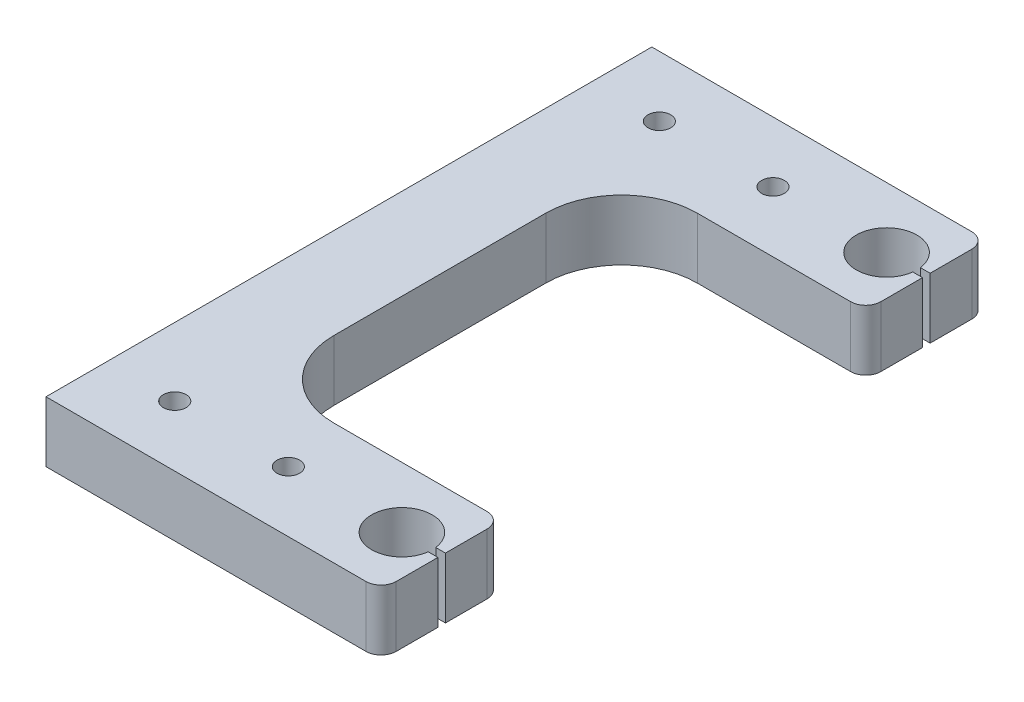
ISO-10303-21;
HEADER;
FILE_DESCRIPTION(('STEP AP214'),'2;1');
FILE_NAME('part.step','',(''),(''),'','','');
FILE_SCHEMA(('AUTOMOTIVE_DESIGN { 1 0 10303 214 1 1 1 1 }'));
ENDSEC;
DATA;
#1=APPLICATION_CONTEXT('core data for automotive mechanical design processes');
#2=APPLICATION_PROTOCOL_DEFINITION('international standard','automotive_design',2000,#1);
#3=PRODUCT_CONTEXT('',#1,'mechanical');
#4=PRODUCT('Part','Part','',(#3));
#5=PRODUCT_RELATED_PRODUCT_CATEGORY('part','',(#4));
#6=PRODUCT_DEFINITION_FORMATION('','',#4);
#7=PRODUCT_DEFINITION_CONTEXT('part definition',#1,'design');
#8=PRODUCT_DEFINITION('design','',#6,#7);
#9=PRODUCT_DEFINITION_SHAPE('','',#8);
#10=(LENGTH_UNIT() NAMED_UNIT(*) SI_UNIT(.MILLI.,.METRE.));
#11=(NAMED_UNIT(*) PLANE_ANGLE_UNIT() SI_UNIT($,.RADIAN.));
#12=(NAMED_UNIT(*) SI_UNIT($,.STERADIAN.) SOLID_ANGLE_UNIT());
#13=UNCERTAINTY_MEASURE_WITH_UNIT(LENGTH_MEASURE(1.E-05),#10,'distance_accuracy_value','');
#14=(GEOMETRIC_REPRESENTATION_CONTEXT(3) GLOBAL_UNCERTAINTY_ASSIGNED_CONTEXT((#13)) GLOBAL_UNIT_ASSIGNED_CONTEXT((#10,
#11,#12)) REPRESENTATION_CONTEXT('',''));
#15=CARTESIAN_POINT('',(0.,0.,0.));
#16=DIRECTION('',(0.,0.,1.));
#17=DIRECTION('',(1.,0.,0.));
#18=AXIS2_PLACEMENT_3D('',#15,#16,#17);
#19=CARTESIAN_POINT('',(44.25,8.,80.));
#20=DIRECTION('',(-1.,0.,0.));
#21=DIRECTION('',(0.,0.,1.));
#22=AXIS2_PLACEMENT_3D('',#19,#20,#21);
#23=PLANE('',#22);
#24=DIRECTION('',(0.,0.,-1.));
#25=VECTOR('',#24,1.);
#26=CARTESIAN_POINT('',(44.25,0.,80.));
#27=LINE('',#26,#25);
#28=CARTESIAN_POINT('',(44.25,0.,71.5));
#29=VERTEX_POINT('',#28);
#30=CARTESIAN_POINT('',(44.25,0.,66.));
#31=VERTEX_POINT('',#30);
#32=EDGE_CURVE('E206',#29,#31,#27,.T.);
#33=ORIENTED_EDGE('',*,*,#32,.T.);
#34=DIRECTION('',(0.,-1.,0.));
#35=VECTOR('',#34,1.);
#36=CARTESIAN_POINT('',(44.25,8.,66.));
#37=LINE('',#36,#35);
#38=CARTESIAN_POINT('',(44.25,8.,66.));
#39=VERTEX_POINT('',#38);
#40=EDGE_CURVE('E343',#31,#39,#37,.F.);
#41=ORIENTED_EDGE('',*,*,#40,.T.);
#42=DIRECTION('',(0.,0.,-1.));
#43=VECTOR('',#42,1.);
#44=CARTESIAN_POINT('',(44.25,8.,80.));
#45=LINE('',#44,#43);
#46=CARTESIAN_POINT('',(44.25,8.,71.5));
#47=VERTEX_POINT('',#46);
#48=EDGE_CURVE('E290',#47,#39,#45,.T.);
#49=ORIENTED_EDGE('',*,*,#48,.F.);
#50=DIRECTION('',(0.,1.,0.));
#51=VECTOR('',#50,1.);
#52=CARTESIAN_POINT('',(44.25,0.,71.5));
#53=LINE('',#52,#51);
#54=EDGE_CURVE('E215',#29,#47,#53,.T.);
#55=ORIENTED_EDGE('',*,*,#54,.F.);
#56=EDGE_LOOP('',(#33,#41,#49,#55));
#57=FACE_BOUND('',#56,.T.);
#58=ADVANCED_FACE('F47',(#57),#23,.F.);
#59=CARTESIAN_POINT('',(44.25,8.,16.));
#60=DIRECTION('',(-1.,0.,0.));
#61=DIRECTION('',(0.,0.,1.));
#62=AXIS2_PLACEMENT_3D('',#59,#60,#61);
#63=PLANE('',#62);
#64=DIRECTION('',(0.,0.,-1.));
#65=VECTOR('',#64,1.);
#66=CARTESIAN_POINT('',(44.25,0.,16.));
#67=LINE('',#66,#65);
#68=CARTESIAN_POINT('',(44.25,0.,7.5));
#69=VERTEX_POINT('',#68);
#70=CARTESIAN_POINT('',(44.25,0.,2.));
#71=VERTEX_POINT('',#70);
#72=EDGE_CURVE('E316',#69,#71,#67,.T.);
#73=ORIENTED_EDGE('',*,*,#72,.T.);
#74=DIRECTION('',(0.,-1.,0.));
#75=VECTOR('',#74,1.);
#76=CARTESIAN_POINT('',(44.25,8.,2.));
#77=LINE('',#76,#75);
#78=CARTESIAN_POINT('',(44.25,8.,2.));
#79=VERTEX_POINT('',#78);
#80=EDGE_CURVE('E359',#71,#79,#77,.F.);
#81=ORIENTED_EDGE('',*,*,#80,.T.);
#82=DIRECTION('',(0.,0.,-1.));
#83=VECTOR('',#82,1.);
#84=CARTESIAN_POINT('',(44.25,8.,16.));
#85=LINE('',#84,#83);
#86=CARTESIAN_POINT('',(44.25,8.,7.5));
#87=VERTEX_POINT('',#86);
#88=EDGE_CURVE('E300',#87,#79,#85,.T.);
#89=ORIENTED_EDGE('',*,*,#88,.F.);
#90=DIRECTION('',(0.,1.,0.));
#91=VECTOR('',#90,1.);
#92=CARTESIAN_POINT('',(44.25,0.,7.5));
#93=LINE('',#92,#91);
#94=EDGE_CURVE('E243',#69,#87,#93,.T.);
#95=ORIENTED_EDGE('',*,*,#94,.F.);
#96=EDGE_LOOP('',(#73,#81,#89,#95));
#97=FACE_BOUND('',#96,.T.);
#98=ADVANCED_FACE('F433',(#97),#63,.F.);
#99=CARTESIAN_POINT('',(0.,8.,0.));
#100=DIRECTION('',(0.,1.,0.));
#101=DIRECTION('',(0.,0.,1.));
#102=AXIS2_PLACEMENT_3D('',#99,#100,#101);
#103=PLANE('',#102);
#104=ORIENTED_EDGE('',*,*,#48,.T.);
#105=CARTESIAN_POINT('',(42.25,8.,66.));
#106=DIRECTION('',(0.,1.,0.));
#107=DIRECTION('',(0.,0.,1.));
#108=AXIS2_PLACEMENT_3D('',#105,#106,#107);
#109=CIRCLE('',#108,2.);
#110=CARTESIAN_POINT('',(42.25,8.,64.));
#111=VERTEX_POINT('',#110);
#112=EDGE_CURVE('E351',#39,#111,#109,.T.);
#113=ORIENTED_EDGE('',*,*,#112,.T.);
#114=DIRECTION('',(-1.,0.,0.));
#115=VECTOR('',#114,1.);
#116=CARTESIAN_POINT('',(44.25,8.,64.));
#117=LINE('',#116,#115);
#118=CARTESIAN_POINT('',(22.,8.,64.));
#119=VERTEX_POINT('',#118);
#120=EDGE_CURVE('E293',#111,#119,#117,.T.);
#121=ORIENTED_EDGE('',*,*,#120,.T.);
#122=CARTESIAN_POINT('',(22.,8.,54.));
#123=DIRECTION('',(0.,1.,0.));
#124=DIRECTION('',(0.,0.,1.));
#125=AXIS2_PLACEMENT_3D('',#122,#123,#124);
#126=CIRCLE('',#125,10.);
#127=CARTESIAN_POINT('',(12.,8.,54.));
#128=VERTEX_POINT('',#127);
#129=EDGE_CURVE('E13',#119,#128,#126,.F.);
#130=ORIENTED_EDGE('',*,*,#129,.T.);
#131=DIRECTION('',(0.,0.,-1.));
#132=VECTOR('',#131,1.);
#133=CARTESIAN_POINT('',(12.,8.,64.));
#134=LINE('',#133,#132);
#135=CARTESIAN_POINT('',(12.,8.,26.));
#136=VERTEX_POINT('',#135);
#137=EDGE_CURVE('E295',#128,#136,#134,.T.);
#138=ORIENTED_EDGE('',*,*,#137,.T.);
#139=CARTESIAN_POINT('',(22.,8.,26.));
#140=DIRECTION('',(0.,1.,0.));
#141=DIRECTION('',(0.,0.,1.));
#142=AXIS2_PLACEMENT_3D('',#139,#140,#141);
#143=CIRCLE('',#142,10.);
#144=CARTESIAN_POINT('',(22.,8.,16.));
#145=VERTEX_POINT('',#144);
#146=EDGE_CURVE('E378',#136,#145,#143,.F.);
#147=ORIENTED_EDGE('',*,*,#146,.T.);
#148=DIRECTION('',(1.,0.,0.));
#149=VECTOR('',#148,1.);
#150=CARTESIAN_POINT('',(12.,8.,16.));
#151=LINE('',#150,#149);
#152=CARTESIAN_POINT('',(42.25,8.,16.));
#153=VERTEX_POINT('',#152);
#154=EDGE_CURVE('E298',#145,#153,#151,.T.);
#155=ORIENTED_EDGE('',*,*,#154,.T.);
#156=CARTESIAN_POINT('',(42.25,8.,14.));
#157=DIRECTION('',(0.,1.,0.));
#158=DIRECTION('',(0.,0.,1.));
#159=AXIS2_PLACEMENT_3D('',#156,#157,#158);
#160=CIRCLE('',#159,2.);
#161=CARTESIAN_POINT('',(44.25,8.,14.));
#162=VERTEX_POINT('',#161);
#163=EDGE_CURVE('E345',#153,#162,#160,.T.);
#164=ORIENTED_EDGE('',*,*,#163,.T.);
#165=CARTESIAN_POINT('',(44.25,8.,8.5));
#166=VERTEX_POINT('',#165);
#167=EDGE_CURVE('E301',#162,#166,#85,.T.);
#168=ORIENTED_EDGE('',*,*,#167,.T.);
#169=DIRECTION('',(1.,0.,0.));
#170=VECTOR('',#169,1.);
#171=CARTESIAN_POINT('',(39.,8.,8.5));
#172=LINE('',#171,#170);
#173=CARTESIAN_POINT('',(42.9686269665969,8.,8.5));
#174=VERTEX_POINT('',#173);
#175=EDGE_CURVE('E230',#174,#166,#172,.T.);
#176=ORIENTED_EDGE('',*,*,#175,.F.);
#177=CARTESIAN_POINT('',(39.,8.,8.));
#178=DIRECTION('',(0.,1.,0.));
#179=DIRECTION('',(0.,0.,1.));
#180=AXIS2_PLACEMENT_3D('',#177,#178,#179);
#181=CIRCLE('',#180,4.00000000000001);
#182=CARTESIAN_POINT('',(42.9686269665969,8.,7.5));
#183=VERTEX_POINT('',#182);
#184=EDGE_CURVE('E276',#183,#174,#181,.T.);
#185=ORIENTED_EDGE('',*,*,#184,.F.);
#186=DIRECTION('',(-1.,0.,0.));
#187=VECTOR('',#186,1.);
#188=CARTESIAN_POINT('',(39.,8.,7.5));
#189=LINE('',#188,#187);
#190=EDGE_CURVE('E236',#87,#183,#189,.T.);
#191=ORIENTED_EDGE('',*,*,#190,.F.);
#192=ORIENTED_EDGE('',*,*,#88,.T.);
#193=CARTESIAN_POINT('',(42.25,8.,2.));
#194=DIRECTION('',(0.,1.,0.));
#195=DIRECTION('',(0.,0.,1.));
#196=AXIS2_PLACEMENT_3D('',#193,#194,#195);
#197=CIRCLE('',#196,2.);
#198=CARTESIAN_POINT('',(42.25,8.,0.));
#199=VERTEX_POINT('',#198);
#200=EDGE_CURVE('E347',#79,#199,#197,.T.);
#201=ORIENTED_EDGE('',*,*,#200,.T.);
#202=DIRECTION('',(-1.,0.,0.));
#203=VECTOR('',#202,1.);
#204=CARTESIAN_POINT('',(44.25,8.,0.));
#205=LINE('',#204,#203);
#206=CARTESIAN_POINT('',(0.,8.,0.));
#207=VERTEX_POINT('',#206);
#208=EDGE_CURVE('E282',#199,#207,#205,.T.);
#209=ORIENTED_EDGE('',*,*,#208,.T.);
#210=DIRECTION('',(0.,0.,1.));
#211=VECTOR('',#210,1.);
#212=CARTESIAN_POINT('',(0.,8.,0.));
#213=LINE('',#212,#211);
#214=CARTESIAN_POINT('',(0.,8.,80.));
#215=VERTEX_POINT('',#214);
#216=EDGE_CURVE('E284',#207,#215,#213,.T.);
#217=ORIENTED_EDGE('',*,*,#216,.T.);
#218=DIRECTION('',(1.,0.,0.));
#219=VECTOR('',#218,1.);
#220=CARTESIAN_POINT('',(0.,8.,80.));
#221=LINE('',#220,#219);
#222=CARTESIAN_POINT('',(42.25,8.,80.));
#223=VERTEX_POINT('',#222);
#224=EDGE_CURVE('E287',#215,#223,#221,.T.);
#225=ORIENTED_EDGE('',*,*,#224,.T.);
#226=CARTESIAN_POINT('',(42.25,8.,78.));
#227=DIRECTION('',(0.,1.,0.));
#228=DIRECTION('',(0.,0.,1.));
#229=AXIS2_PLACEMENT_3D('',#226,#227,#228);
#230=CIRCLE('',#229,2.);
#231=CARTESIAN_POINT('',(44.25,8.,78.));
#232=VERTEX_POINT('',#231);
#233=EDGE_CURVE('E349',#223,#232,#230,.T.);
#234=ORIENTED_EDGE('',*,*,#233,.T.);
#235=CARTESIAN_POINT('',(44.25,8.,72.5));
#236=VERTEX_POINT('',#235);
#237=EDGE_CURVE('E291',#232,#236,#45,.T.);
#238=ORIENTED_EDGE('',*,*,#237,.T.);
#239=DIRECTION('',(1.,0.,0.));
#240=VECTOR('',#239,1.);
#241=CARTESIAN_POINT('',(39.,8.,72.5));
#242=LINE('',#241,#240);
#243=CARTESIAN_POINT('',(42.9686269665969,8.,72.5));
#244=VERTEX_POINT('',#243);
#245=EDGE_CURVE('E214',#244,#236,#242,.T.);
#246=ORIENTED_EDGE('',*,*,#245,.F.);
#247=CARTESIAN_POINT('',(39.,8.,72.));
#248=DIRECTION('',(0.,1.,0.));
#249=DIRECTION('',(0.,0.,-1.));
#250=AXIS2_PLACEMENT_3D('',#247,#248,#249);
#251=CIRCLE('',#250,4.00000000000001);
#252=CARTESIAN_POINT('',(42.9686269665969,8.,71.5));
#253=VERTEX_POINT('',#252);
#254=EDGE_CURVE('E271',#253,#244,#251,.T.);
#255=ORIENTED_EDGE('',*,*,#254,.F.);
#256=DIRECTION('',(-1.,0.,0.));
#257=VECTOR('',#256,1.);
#258=CARTESIAN_POINT('',(39.,8.,71.5));
#259=LINE('',#258,#257);
#260=EDGE_CURVE('E224',#47,#253,#259,.T.);
#261=ORIENTED_EDGE('',*,*,#260,.F.);
#262=EDGE_LOOP('',(#104,#113,#121,#130,#138,#147,#155,#164,#168,#176,#185,#191,#192,#201,#209,
#217,#225,#234,#238,#246,#255,#261));
#263=FACE_BOUND('',#262,.T.);
#264=CARTESIAN_POINT('',(24.,8.,72.));
#265=DIRECTION('',(0.,1.,0.));
#266=DIRECTION('',(0.,0.,-1.));
#267=AXIS2_PLACEMENT_3D('',#264,#265,#266);
#268=CIRCLE('',#267,1.5);
#269=CARTESIAN_POINT('',(24.,8.,70.5));
#270=VERTEX_POINT('',#269);
#271=EDGE_CURVE('E254',#270,#270,#268,.T.);
#272=ORIENTED_EDGE('',*,*,#271,.F.);
#273=EDGE_LOOP('',(#272));
#274=FACE_BOUND('',#273,.T.);
#275=CARTESIAN_POINT('',(24.,8.,8.));
#276=DIRECTION('',(0.,1.,0.));
#277=DIRECTION('',(0.,0.,1.));
#278=AXIS2_PLACEMENT_3D('',#275,#276,#277);
#279=CIRCLE('',#278,1.5);
#280=CARTESIAN_POINT('',(24.,8.,9.5));
#281=VERTEX_POINT('',#280);
#282=EDGE_CURVE('E266',#281,#281,#279,.T.);
#283=ORIENTED_EDGE('',*,*,#282,.F.);
#284=EDGE_LOOP('',(#283));
#285=FACE_BOUND('',#284,.T.);
#286=CARTESIAN_POINT('',(9.,8.,8.));
#287=DIRECTION('',(0.,1.,0.));
#288=DIRECTION('',(0.,0.,1.));
#289=AXIS2_PLACEMENT_3D('',#286,#287,#288);
#290=CIRCLE('',#289,1.5);
#291=CARTESIAN_POINT('',(9.,8.,9.5));
#292=VERTEX_POINT('',#291);
#293=EDGE_CURVE('E260',#292,#292,#290,.T.);
#294=ORIENTED_EDGE('',*,*,#293,.F.);
#295=EDGE_LOOP('',(#294));
#296=FACE_BOUND('',#295,.T.);
#297=CARTESIAN_POINT('',(8.99999999999999,8.,72.));
#298=DIRECTION('',(0.,1.,0.));
#299=DIRECTION('',(0.,0.,-1.));
#300=AXIS2_PLACEMENT_3D('',#297,#298,#299);
#301=CIRCLE('',#300,1.5);
#302=CARTESIAN_POINT('',(8.99999999999999,8.,70.5));
#303=VERTEX_POINT('',#302);
#304=EDGE_CURVE('E248',#303,#303,#301,.T.);
#305=ORIENTED_EDGE('',*,*,#304,.F.);
#306=EDGE_LOOP('',(#305));
#307=FACE_BOUND('',#306,.T.);
#308=ADVANCED_FACE('F383',(#263,#274,#285,#296,#307),#103,.T.);
#309=CARTESIAN_POINT('',(0.,0.,0.));
#310=DIRECTION('',(0.,1.,0.));
#311=DIRECTION('',(0.,0.,1.));
#312=AXIS2_PLACEMENT_3D('',#309,#310,#311);
#313=PLANE('',#312);
#314=DIRECTION('',(-1.,0.,0.));
#315=VECTOR('',#314,1.);
#316=CARTESIAN_POINT('',(44.25,0.,64.));
#317=LINE('',#316,#315);
#318=CARTESIAN_POINT('',(42.25,0.,64.));
#319=VERTEX_POINT('',#318);
#320=CARTESIAN_POINT('',(22.,0.,64.));
#321=VERTEX_POINT('',#320);
#322=EDGE_CURVE('E205',#319,#321,#317,.T.);
#323=ORIENTED_EDGE('',*,*,#322,.F.);
#324=CARTESIAN_POINT('',(42.25,0.,66.));
#325=DIRECTION('',(0.,1.,0.));
#326=DIRECTION('',(0.,0.,1.));
#327=AXIS2_PLACEMENT_3D('',#324,#325,#326);
#328=CIRCLE('',#327,2.);
#329=EDGE_CURVE('E341',#319,#31,#328,.F.);
#330=ORIENTED_EDGE('',*,*,#329,.T.);
#331=ORIENTED_EDGE('',*,*,#32,.F.);
#332=DIRECTION('',(-1.,0.,0.));
#333=VECTOR('',#332,1.);
#334=CARTESIAN_POINT('',(39.,0.,71.5));
#335=LINE('',#334,#333);
#336=CARTESIAN_POINT('',(42.9686269665969,0.,71.5));
#337=VERTEX_POINT('',#336);
#338=EDGE_CURVE('E216',#29,#337,#335,.T.);
#339=ORIENTED_EDGE('',*,*,#338,.T.);
#340=CARTESIAN_POINT('',(39.,0.,72.));
#341=DIRECTION('',(0.,1.,0.));
#342=DIRECTION('',(0.,0.,-1.));
#343=AXIS2_PLACEMENT_3D('',#340,#341,#342);
#344=CIRCLE('',#343,4.00000000000001);
#345=CARTESIAN_POINT('',(42.9686269665969,0.,72.5));
#346=VERTEX_POINT('',#345);
#347=EDGE_CURVE('E223',#337,#346,#344,.T.);
#348=ORIENTED_EDGE('',*,*,#347,.T.);
#349=DIRECTION('',(1.,0.,0.));
#350=VECTOR('',#349,1.);
#351=CARTESIAN_POINT('',(39.,0.,72.5));
#352=LINE('',#351,#350);
#353=CARTESIAN_POINT('',(44.25,0.,72.5));
#354=VERTEX_POINT('',#353);
#355=EDGE_CURVE('E211',#346,#354,#352,.T.);
#356=ORIENTED_EDGE('',*,*,#355,.T.);
#357=CARTESIAN_POINT('',(44.25,0.,78.));
#358=VERTEX_POINT('',#357);
#359=EDGE_CURVE('E197',#358,#354,#27,.T.);
#360=ORIENTED_EDGE('',*,*,#359,.F.);
#361=CARTESIAN_POINT('',(42.25,0.,78.));
#362=DIRECTION('',(0.,1.,0.));
#363=DIRECTION('',(0.,0.,1.));
#364=AXIS2_PLACEMENT_3D('',#361,#362,#363);
#365=CIRCLE('',#364,2.);
#366=CARTESIAN_POINT('',(42.25,0.,80.));
#367=VERTEX_POINT('',#366);
#368=EDGE_CURVE('E339',#358,#367,#365,.F.);
#369=ORIENTED_EDGE('',*,*,#368,.T.);
#370=DIRECTION('',(1.,0.,0.));
#371=VECTOR('',#370,1.);
#372=CARTESIAN_POINT('',(0.,0.,80.));
#373=LINE('',#372,#371);
#374=CARTESIAN_POINT('',(0.,0.,80.));
#375=VERTEX_POINT('',#374);
#376=EDGE_CURVE('E307',#375,#367,#373,.T.);
#377=ORIENTED_EDGE('',*,*,#376,.F.);
#378=DIRECTION('',(0.,0.,1.));
#379=VECTOR('',#378,1.);
#380=CARTESIAN_POINT('',(0.,0.,0.));
#381=LINE('',#380,#379);
#382=CARTESIAN_POINT('',(0.,0.,0.));
#383=VERTEX_POINT('',#382);
#384=EDGE_CURVE('E305',#383,#375,#381,.T.);
#385=ORIENTED_EDGE('',*,*,#384,.F.);
#386=DIRECTION('',(-1.,0.,0.));
#387=VECTOR('',#386,1.);
#388=CARTESIAN_POINT('',(44.25,0.,0.));
#389=LINE('',#388,#387);
#390=CARTESIAN_POINT('',(42.25,0.,0.));
#391=VERTEX_POINT('',#390);
#392=EDGE_CURVE('E279',#391,#383,#389,.T.);
#393=ORIENTED_EDGE('',*,*,#392,.F.);
#394=CARTESIAN_POINT('',(42.25,0.,2.));
#395=DIRECTION('',(0.,1.,0.));
#396=DIRECTION('',(0.,0.,1.));
#397=AXIS2_PLACEMENT_3D('',#394,#395,#396);
#398=CIRCLE('',#397,2.);
#399=EDGE_CURVE('E337',#391,#71,#398,.F.);
#400=ORIENTED_EDGE('',*,*,#399,.T.);
#401=ORIENTED_EDGE('',*,*,#72,.F.);
#402=DIRECTION('',(-1.,0.,0.));
#403=VECTOR('',#402,1.);
#404=CARTESIAN_POINT('',(39.,0.,7.5));
#405=LINE('',#404,#403);
#406=CARTESIAN_POINT('',(42.9686269665969,0.,7.5));
#407=VERTEX_POINT('',#406);
#408=EDGE_CURVE('E235',#69,#407,#405,.T.);
#409=ORIENTED_EDGE('',*,*,#408,.T.);
#410=CARTESIAN_POINT('',(39.,0.,8.));
#411=DIRECTION('',(0.,1.,0.));
#412=DIRECTION('',(0.,0.,1.));
#413=AXIS2_PLACEMENT_3D('',#410,#411,#412);
#414=CIRCLE('',#413,4.00000000000001);
#415=CARTESIAN_POINT('',(42.9686269665969,0.,8.5));
#416=VERTEX_POINT('',#415);
#417=EDGE_CURVE('E274',#407,#416,#414,.T.);
#418=ORIENTED_EDGE('',*,*,#417,.T.);
#419=DIRECTION('',(1.,0.,0.));
#420=VECTOR('',#419,1.);
#421=CARTESIAN_POINT('',(39.,0.,8.5));
#422=LINE('',#421,#420);
#423=CARTESIAN_POINT('',(44.25,0.,8.5));
#424=VERTEX_POINT('',#423);
#425=EDGE_CURVE('E232',#416,#424,#422,.T.);
#426=ORIENTED_EDGE('',*,*,#425,.T.);
#427=CARTESIAN_POINT('',(44.25,0.,14.));
#428=VERTEX_POINT('',#427);
#429=EDGE_CURVE('E285',#428,#424,#67,.T.);
#430=ORIENTED_EDGE('',*,*,#429,.F.);
#431=CARTESIAN_POINT('',(42.25,0.,14.));
#432=DIRECTION('',(0.,1.,0.));
#433=DIRECTION('',(0.,0.,1.));
#434=AXIS2_PLACEMENT_3D('',#431,#432,#433);
#435=CIRCLE('',#434,2.);
#436=CARTESIAN_POINT('',(42.25,0.,16.));
#437=VERTEX_POINT('',#436);
#438=EDGE_CURVE('E334',#428,#437,#435,.F.);
#439=ORIENTED_EDGE('',*,*,#438,.T.);
#440=DIRECTION('',(1.,0.,0.));
#441=VECTOR('',#440,1.);
#442=CARTESIAN_POINT('',(12.,0.,16.));
#443=LINE('',#442,#441);
#444=CARTESIAN_POINT('',(22.,0.,16.));
#445=VERTEX_POINT('',#444);
#446=EDGE_CURVE('E314',#445,#437,#443,.T.);
#447=ORIENTED_EDGE('',*,*,#446,.F.);
#448=CARTESIAN_POINT('',(22.,0.,26.));
#449=DIRECTION('',(0.,1.,0.));
#450=DIRECTION('',(0.,0.,1.));
#451=AXIS2_PLACEMENT_3D('',#448,#449,#450);
#452=CIRCLE('',#451,10.);
#453=CARTESIAN_POINT('',(12.,0.,26.));
#454=VERTEX_POINT('',#453);
#455=EDGE_CURVE('E376',#445,#454,#452,.T.);
#456=ORIENTED_EDGE('',*,*,#455,.T.);
#457=DIRECTION('',(0.,0.,-1.));
#458=VECTOR('',#457,1.);
#459=CARTESIAN_POINT('',(12.,0.,64.));
#460=LINE('',#459,#458);
#461=CARTESIAN_POINT('',(12.,0.,54.));
#462=VERTEX_POINT('',#461);
#463=EDGE_CURVE('E311',#462,#454,#460,.T.);
#464=ORIENTED_EDGE('',*,*,#463,.F.);
#465=CARTESIAN_POINT('',(22.,0.,54.));
#466=DIRECTION('',(0.,1.,0.));
#467=DIRECTION('',(0.,0.,1.));
#468=AXIS2_PLACEMENT_3D('',#465,#466,#467);
#469=CIRCLE('',#468,10.);
#470=EDGE_CURVE('E55',#462,#321,#469,.T.);
#471=ORIENTED_EDGE('',*,*,#470,.T.);
#472=EDGE_LOOP('',(#323,#330,#331,#339,#348,#356,#360,#369,#377,#385,#393,#400,#401,#409,#418,
#426,#430,#439,#447,#456,#464,#471));
#473=FACE_BOUND('',#472,.T.);
#474=CARTESIAN_POINT('',(24.,0.,8.));
#475=DIRECTION('',(0.,1.,0.));
#476=DIRECTION('',(0.,0.,1.));
#477=AXIS2_PLACEMENT_3D('',#474,#475,#476);
#478=CIRCLE('',#477,1.5);
#479=CARTESIAN_POINT('',(24.,0.,9.5));
#480=VERTEX_POINT('',#479);
#481=EDGE_CURVE('E263',#480,#480,#478,.T.);
#482=ORIENTED_EDGE('',*,*,#481,.T.);
#483=EDGE_LOOP('',(#482));
#484=FACE_BOUND('',#483,.T.);
#485=CARTESIAN_POINT('',(9.,0.,8.));
#486=DIRECTION('',(0.,1.,0.));
#487=DIRECTION('',(0.,0.,1.));
#488=AXIS2_PLACEMENT_3D('',#485,#486,#487);
#489=CIRCLE('',#488,1.5);
#490=CARTESIAN_POINT('',(9.,0.,9.5));
#491=VERTEX_POINT('',#490);
#492=EDGE_CURVE('E257',#491,#491,#489,.T.);
#493=ORIENTED_EDGE('',*,*,#492,.T.);
#494=EDGE_LOOP('',(#493));
#495=FACE_BOUND('',#494,.T.);
#496=CARTESIAN_POINT('',(24.,0.,72.));
#497=DIRECTION('',(0.,1.,0.));
#498=DIRECTION('',(0.,0.,-1.));
#499=AXIS2_PLACEMENT_3D('',#496,#497,#498);
#500=CIRCLE('',#499,1.5);
#501=CARTESIAN_POINT('',(24.,0.,70.5));
#502=VERTEX_POINT('',#501);
#503=EDGE_CURVE('E251',#502,#502,#500,.T.);
#504=ORIENTED_EDGE('',*,*,#503,.T.);
#505=EDGE_LOOP('',(#504));
#506=FACE_BOUND('',#505,.T.);
#507=CARTESIAN_POINT('',(8.99999999999999,0.,72.));
#508=DIRECTION('',(0.,1.,0.));
#509=DIRECTION('',(0.,0.,-1.));
#510=AXIS2_PLACEMENT_3D('',#507,#508,#509);
#511=CIRCLE('',#510,1.5);
#512=CARTESIAN_POINT('',(8.99999999999999,0.,70.5));
#513=VERTEX_POINT('',#512);
#514=EDGE_CURVE('E245',#513,#513,#511,.T.);
#515=ORIENTED_EDGE('',*,*,#514,.T.);
#516=EDGE_LOOP('',(#515));
#517=FACE_BOUND('',#516,.T.);
#518=ADVANCED_FACE('F219',(#473,#484,#495,#506,#517),#313,.F.);
#519=CARTESIAN_POINT('',(44.25,8.,0.));
#520=DIRECTION('',(0.,0.,1.));
#521=DIRECTION('',(1.,0.,0.));
#522=AXIS2_PLACEMENT_3D('',#519,#520,#521);
#523=PLANE('',#522);
#524=ORIENTED_EDGE('',*,*,#208,.F.);
#525=DIRECTION('',(0.,-1.,0.));
#526=VECTOR('',#525,1.);
#527=CARTESIAN_POINT('',(42.25,8.,0.));
#528=LINE('',#527,#526);
#529=EDGE_CURVE('E356',#199,#391,#528,.T.);
#530=ORIENTED_EDGE('',*,*,#529,.T.);
#531=ORIENTED_EDGE('',*,*,#392,.T.);
#532=DIRECTION('',(0.,-1.,0.));
#533=VECTOR('',#532,1.);
#534=CARTESIAN_POINT('',(0.,8.,0.));
#535=LINE('',#534,#533);
#536=EDGE_CURVE('E320',#207,#383,#535,.T.);
#537=ORIENTED_EDGE('',*,*,#536,.F.);
#538=EDGE_LOOP('',(#524,#530,#531,#537));
#539=FACE_BOUND('',#538,.T.);
#540=ADVANCED_FACE('F453',(#539),#523,.F.);
#541=CARTESIAN_POINT('',(0.,8.,0.));
#542=DIRECTION('',(1.,0.,0.));
#543=DIRECTION('',(0.,0.,-1.));
#544=AXIS2_PLACEMENT_3D('',#541,#542,#543);
#545=PLANE('',#544);
#546=ORIENTED_EDGE('',*,*,#384,.T.);
#547=DIRECTION('',(0.,-1.,0.));
#548=VECTOR('',#547,1.);
#549=CARTESIAN_POINT('',(0.,8.,80.));
#550=LINE('',#549,#548);
#551=EDGE_CURVE('E303',#215,#375,#550,.T.);
#552=ORIENTED_EDGE('',*,*,#551,.F.);
#553=ORIENTED_EDGE('',*,*,#216,.F.);
#554=ORIENTED_EDGE('',*,*,#536,.T.);
#555=EDGE_LOOP('',(#546,#552,#553,#554));
#556=FACE_BOUND('',#555,.T.);
#557=ADVANCED_FACE('F448',(#556),#545,.F.);
#558=CARTESIAN_POINT('',(0.,8.,80.));
#559=DIRECTION('',(0.,0.,-1.));
#560=DIRECTION('',(-1.,0.,0.));
#561=AXIS2_PLACEMENT_3D('',#558,#559,#560);
#562=PLANE('',#561);
#563=ORIENTED_EDGE('',*,*,#376,.T.);
#564=DIRECTION('',(0.,-1.,0.));
#565=VECTOR('',#564,1.);
#566=CARTESIAN_POINT('',(42.25,8.,80.));
#567=LINE('',#566,#565);
#568=EDGE_CURVE('E354',#367,#223,#567,.F.);
#569=ORIENTED_EDGE('',*,*,#568,.T.);
#570=ORIENTED_EDGE('',*,*,#224,.F.);
#571=ORIENTED_EDGE('',*,*,#551,.T.);
#572=EDGE_LOOP('',(#563,#569,#570,#571));
#573=FACE_BOUND('',#572,.T.);
#574=ADVANCED_FACE('F443',(#573),#562,.F.);
#575=ORIENTED_EDGE('',*,*,#237,.F.);
#576=DIRECTION('',(0.,-1.,0.));
#577=VECTOR('',#576,1.);
#578=CARTESIAN_POINT('',(44.25,8.,78.));
#579=LINE('',#578,#577);
#580=EDGE_CURVE('E203',#232,#358,#579,.T.);
#581=ORIENTED_EDGE('',*,*,#580,.T.);
#582=ORIENTED_EDGE('',*,*,#359,.T.);
#583=DIRECTION('',(0.,1.,0.));
#584=VECTOR('',#583,1.);
#585=CARTESIAN_POINT('',(44.25,0.,72.5));
#586=LINE('',#585,#584);
#587=EDGE_CURVE('E201',#354,#236,#586,.T.);
#588=ORIENTED_EDGE('',*,*,#587,.T.);
#589=EDGE_LOOP('',(#575,#581,#582,#588));
#590=FACE_BOUND('',#589,.T.);
#591=ADVANCED_FACE('F200',(#590),#23,.F.);
#592=CARTESIAN_POINT('',(44.25,8.,64.));
#593=DIRECTION('',(0.,0.,1.));
#594=DIRECTION('',(1.,0.,0.));
#595=AXIS2_PLACEMENT_3D('',#592,#593,#594);
#596=PLANE('',#595);
#597=ORIENTED_EDGE('',*,*,#322,.T.);
#598=DIRECTION('',(0.,-1.,0.));
#599=VECTOR('',#598,1.);
#600=CARTESIAN_POINT('',(22.,8.,64.));
#601=LINE('',#600,#599);
#602=EDGE_CURVE('E68',#321,#119,#601,.F.);
#603=ORIENTED_EDGE('',*,*,#602,.T.);
#604=ORIENTED_EDGE('',*,*,#120,.F.);
#605=DIRECTION('',(0.,-1.,0.));
#606=VECTOR('',#605,1.);
#607=CARTESIAN_POINT('',(42.25,8.,64.));
#608=LINE('',#607,#606);
#609=EDGE_CURVE('E331',#111,#319,#608,.T.);
#610=ORIENTED_EDGE('',*,*,#609,.T.);
#611=EDGE_LOOP('',(#597,#603,#604,#610));
#612=FACE_BOUND('',#611,.T.);
#613=ADVANCED_FACE('F402',(#612),#596,.F.);
#614=CARTESIAN_POINT('',(12.,8.,64.));
#615=DIRECTION('',(-1.,0.,0.));
#616=DIRECTION('',(0.,0.,1.));
#617=AXIS2_PLACEMENT_3D('',#614,#615,#616);
#618=PLANE('',#617);
#619=ORIENTED_EDGE('',*,*,#463,.T.);
#620=DIRECTION('',(0.,-1.,0.));
#621=VECTOR('',#620,1.);
#622=CARTESIAN_POINT('',(12.,8.,26.));
#623=LINE('',#622,#621);
#624=EDGE_CURVE('E373',#454,#136,#623,.F.);
#625=ORIENTED_EDGE('',*,*,#624,.T.);
#626=ORIENTED_EDGE('',*,*,#137,.F.);
#627=DIRECTION('',(0.,-1.,0.));
#628=VECTOR('',#627,1.);
#629=CARTESIAN_POINT('',(12.,0.,54.));
#630=LINE('',#629,#628);
#631=EDGE_CURVE('E370',#128,#462,#630,.T.);
#632=ORIENTED_EDGE('',*,*,#631,.T.);
#633=EDGE_LOOP('',(#619,#625,#626,#632));
#634=FACE_BOUND('',#633,.T.);
#635=ADVANCED_FACE('F396',(#634),#618,.F.);
#636=CARTESIAN_POINT('',(12.,8.,16.));
#637=DIRECTION('',(0.,0.,-1.));
#638=DIRECTION('',(-1.,0.,0.));
#639=AXIS2_PLACEMENT_3D('',#636,#637,#638);
#640=PLANE('',#639);
#641=ORIENTED_EDGE('',*,*,#154,.F.);
#642=DIRECTION('',(0.,-1.,0.));
#643=VECTOR('',#642,1.);
#644=CARTESIAN_POINT('',(22.,0.,16.));
#645=LINE('',#644,#643);
#646=EDGE_CURVE('E367',#145,#445,#645,.T.);
#647=ORIENTED_EDGE('',*,*,#646,.T.);
#648=ORIENTED_EDGE('',*,*,#446,.T.);
#649=DIRECTION('',(0.,-1.,0.));
#650=VECTOR('',#649,1.);
#651=CARTESIAN_POINT('',(42.25,8.,16.));
#652=LINE('',#651,#650);
#653=EDGE_CURVE('E364',#437,#153,#652,.F.);
#654=ORIENTED_EDGE('',*,*,#653,.T.);
#655=EDGE_LOOP('',(#641,#647,#648,#654));
#656=FACE_BOUND('',#655,.T.);
#657=ADVANCED_FACE('F390',(#656),#640,.F.);
#658=ORIENTED_EDGE('',*,*,#167,.F.);
#659=DIRECTION('',(0.,-1.,0.));
#660=VECTOR('',#659,1.);
#661=CARTESIAN_POINT('',(44.25,8.,14.));
#662=LINE('',#661,#660);
#663=EDGE_CURVE('E361',#162,#428,#662,.T.);
#664=ORIENTED_EDGE('',*,*,#663,.T.);
#665=ORIENTED_EDGE('',*,*,#429,.T.);
#666=DIRECTION('',(0.,1.,0.));
#667=VECTOR('',#666,1.);
#668=CARTESIAN_POINT('',(44.25,0.,8.5));
#669=LINE('',#668,#667);
#670=EDGE_CURVE('E239',#424,#166,#669,.T.);
#671=ORIENTED_EDGE('',*,*,#670,.T.);
#672=EDGE_LOOP('',(#658,#664,#665,#671));
#673=FACE_BOUND('',#672,.T.);
#674=ADVANCED_FACE('F429',(#673),#63,.F.);
#675=CARTESIAN_POINT('',(39.,8.,8.));
#676=DIRECTION('',(0.,-1.,0.));
#677=DIRECTION('',(0.,0.,-1.));
#678=AXIS2_PLACEMENT_3D('',#675,#676,#677);
#679=CYLINDRICAL_SURFACE('',#678,4.00000000000001);
#680=DIRECTION('',(0.,-1.,0.));
#681=VECTOR('',#680,1.);
#682=CARTESIAN_POINT('',(42.9686269665969,8.,7.5));
#683=LINE('',#682,#681);
#684=EDGE_CURVE('E325',#183,#407,#683,.T.);
#685=ORIENTED_EDGE('',*,*,#684,.F.);
#686=ORIENTED_EDGE('',*,*,#184,.T.);
#687=DIRECTION('',(0.,-1.,0.));
#688=VECTOR('',#687,1.);
#689=CARTESIAN_POINT('',(42.9686269665969,8.,8.5));
#690=LINE('',#689,#688);
#691=EDGE_CURVE('E323',#416,#174,#690,.F.);
#692=ORIENTED_EDGE('',*,*,#691,.F.);
#693=ORIENTED_EDGE('',*,*,#417,.F.);
#694=EDGE_LOOP('',(#685,#686,#692,#693));
#695=FACE_BOUND('',#694,.T.);
#696=ADVANCED_FACE('F420',(#695),#679,.F.);
#697=CARTESIAN_POINT('',(39.,8.,72.));
#698=DIRECTION('',(0.,-1.,0.));
#699=DIRECTION('',(0.,0.,-1.));
#700=AXIS2_PLACEMENT_3D('',#697,#698,#699);
#701=CYLINDRICAL_SURFACE('',#700,4.00000000000001);
#702=DIRECTION('',(0.,-1.,0.));
#703=VECTOR('',#702,1.);
#704=CARTESIAN_POINT('',(42.9686269665969,8.,71.5));
#705=LINE('',#704,#703);
#706=EDGE_CURVE('E329',#253,#337,#705,.T.);
#707=ORIENTED_EDGE('',*,*,#706,.F.);
#708=ORIENTED_EDGE('',*,*,#254,.T.);
#709=DIRECTION('',(0.,-1.,0.));
#710=VECTOR('',#709,1.);
#711=CARTESIAN_POINT('',(42.9686269665969,8.,72.5));
#712=LINE('',#711,#710);
#713=EDGE_CURVE('E327',#346,#244,#712,.F.);
#714=ORIENTED_EDGE('',*,*,#713,.F.);
#715=ORIENTED_EDGE('',*,*,#347,.F.);
#716=EDGE_LOOP('',(#707,#708,#714,#715));
#717=FACE_BOUND('',#716,.T.);
#718=ADVANCED_FACE('F417',(#717),#701,.F.);
#719=CARTESIAN_POINT('',(24.,8.,8.));
#720=DIRECTION('',(0.,-1.,0.));
#721=DIRECTION('',(0.,0.,-1.));
#722=AXIS2_PLACEMENT_3D('',#719,#720,#721);
#723=CYLINDRICAL_SURFACE('',#722,1.5);
#724=ORIENTED_EDGE('',*,*,#282,.T.);
#725=EDGE_LOOP('',(#724));
#726=FACE_BOUND('',#725,.T.);
#727=ORIENTED_EDGE('',*,*,#481,.F.);
#728=EDGE_LOOP('',(#727));
#729=FACE_BOUND('',#728,.T.);
#730=ADVANCED_FACE('F419',(#726,#729),#723,.F.);
#731=CARTESIAN_POINT('',(9.,8.,8.));
#732=DIRECTION('',(0.,-1.,0.));
#733=DIRECTION('',(0.,0.,-1.));
#734=AXIS2_PLACEMENT_3D('',#731,#732,#733);
#735=CYLINDRICAL_SURFACE('',#734,1.5);
#736=ORIENTED_EDGE('',*,*,#293,.T.);
#737=EDGE_LOOP('',(#736));
#738=FACE_BOUND('',#737,.T.);
#739=ORIENTED_EDGE('',*,*,#492,.F.);
#740=EDGE_LOOP('',(#739));
#741=FACE_BOUND('',#740,.T.);
#742=ADVANCED_FACE('F426',(#738,#741),#735,.F.);
#743=CARTESIAN_POINT('',(24.,8.,72.));
#744=DIRECTION('',(0.,-1.,0.));
#745=DIRECTION('',(0.,0.,-1.));
#746=AXIS2_PLACEMENT_3D('',#743,#744,#745);
#747=CYLINDRICAL_SURFACE('',#746,1.5);
#748=ORIENTED_EDGE('',*,*,#271,.T.);
#749=EDGE_LOOP('',(#748));
#750=FACE_BOUND('',#749,.T.);
#751=ORIENTED_EDGE('',*,*,#503,.F.);
#752=EDGE_LOOP('',(#751));
#753=FACE_BOUND('',#752,.T.);
#754=ADVANCED_FACE('F635',(#750,#753),#747,.F.);
#755=CARTESIAN_POINT('',(8.99999999999999,8.,72.));
#756=DIRECTION('',(0.,-1.,0.));
#757=DIRECTION('',(0.,0.,-1.));
#758=AXIS2_PLACEMENT_3D('',#755,#756,#757);
#759=CYLINDRICAL_SURFACE('',#758,1.5);
#760=ORIENTED_EDGE('',*,*,#304,.T.);
#761=EDGE_LOOP('',(#760));
#762=FACE_BOUND('',#761,.T.);
#763=ORIENTED_EDGE('',*,*,#514,.F.);
#764=EDGE_LOOP('',(#763));
#765=FACE_BOUND('',#764,.T.);
#766=ADVANCED_FACE('F615',(#762,#765),#759,.F.);
#767=CARTESIAN_POINT('',(39.,0.,8.5));
#768=DIRECTION('',(0.,0.,1.));
#769=DIRECTION('',(1.,0.,0.));
#770=AXIS2_PLACEMENT_3D('',#767,#768,#769);
#771=PLANE('',#770);
#772=ORIENTED_EDGE('',*,*,#691,.T.);
#773=ORIENTED_EDGE('',*,*,#175,.T.);
#774=ORIENTED_EDGE('',*,*,#670,.F.);
#775=ORIENTED_EDGE('',*,*,#425,.F.);
#776=EDGE_LOOP('',(#772,#773,#774,#775));
#777=FACE_BOUND('',#776,.T.);
#778=ADVANCED_FACE('F607',(#777),#771,.F.);
#779=CARTESIAN_POINT('',(39.,0.,7.5));
#780=DIRECTION('',(0.,0.,-1.));
#781=DIRECTION('',(-1.,0.,0.));
#782=AXIS2_PLACEMENT_3D('',#779,#780,#781);
#783=PLANE('',#782);
#784=ORIENTED_EDGE('',*,*,#684,.T.);
#785=ORIENTED_EDGE('',*,*,#408,.F.);
#786=ORIENTED_EDGE('',*,*,#94,.T.);
#787=ORIENTED_EDGE('',*,*,#190,.T.);
#788=EDGE_LOOP('',(#784,#785,#786,#787));
#789=FACE_BOUND('',#788,.T.);
#790=ADVANCED_FACE('F598',(#789),#783,.F.);
#791=CARTESIAN_POINT('',(39.,0.,72.5));
#792=DIRECTION('',(0.,0.,1.));
#793=DIRECTION('',(1.,0.,0.));
#794=AXIS2_PLACEMENT_3D('',#791,#792,#793);
#795=PLANE('',#794);
#796=ORIENTED_EDGE('',*,*,#713,.T.);
#797=ORIENTED_EDGE('',*,*,#245,.T.);
#798=ORIENTED_EDGE('',*,*,#587,.F.);
#799=ORIENTED_EDGE('',*,*,#355,.F.);
#800=EDGE_LOOP('',(#796,#797,#798,#799));
#801=FACE_BOUND('',#800,.T.);
#802=ADVANCED_FACE('F210',(#801),#795,.F.);
#803=CARTESIAN_POINT('',(39.,0.,71.5));
#804=DIRECTION('',(0.,0.,-1.));
#805=DIRECTION('',(-1.,0.,0.));
#806=AXIS2_PLACEMENT_3D('',#803,#804,#805);
#807=PLANE('',#806);
#808=ORIENTED_EDGE('',*,*,#706,.T.);
#809=ORIENTED_EDGE('',*,*,#338,.F.);
#810=ORIENTED_EDGE('',*,*,#54,.T.);
#811=ORIENTED_EDGE('',*,*,#260,.T.);
#812=EDGE_LOOP('',(#808,#809,#810,#811));
#813=FACE_BOUND('',#812,.T.);
#814=ADVANCED_FACE('F413',(#813),#807,.F.);
#815=CARTESIAN_POINT('',(42.25,8.,66.));
#816=DIRECTION('',(0.,-1.,0.));
#817=DIRECTION('',(0.,0.,-1.));
#818=AXIS2_PLACEMENT_3D('',#815,#816,#817);
#819=CYLINDRICAL_SURFACE('',#818,2.);
#820=ORIENTED_EDGE('',*,*,#112,.F.);
#821=ORIENTED_EDGE('',*,*,#40,.F.);
#822=ORIENTED_EDGE('',*,*,#329,.F.);
#823=ORIENTED_EDGE('',*,*,#609,.F.);
#824=EDGE_LOOP('',(#820,#821,#822,#823));
#825=FACE_BOUND('',#824,.T.);
#826=ADVANCED_FACE('F404',(#825),#819,.T.);
#827=CARTESIAN_POINT('',(42.25,8.,78.));
#828=DIRECTION('',(0.,-1.,0.));
#829=DIRECTION('',(0.,0.,-1.));
#830=AXIS2_PLACEMENT_3D('',#827,#828,#829);
#831=CYLINDRICAL_SURFACE('',#830,2.);
#832=ORIENTED_EDGE('',*,*,#233,.F.);
#833=ORIENTED_EDGE('',*,*,#568,.F.);
#834=ORIENTED_EDGE('',*,*,#368,.F.);
#835=ORIENTED_EDGE('',*,*,#580,.F.);
#836=EDGE_LOOP('',(#832,#833,#834,#835));
#837=FACE_BOUND('',#836,.T.);
#838=ADVANCED_FACE('F462',(#837),#831,.T.);
#839=CARTESIAN_POINT('',(42.25,8.,2.));
#840=DIRECTION('',(0.,-1.,0.));
#841=DIRECTION('',(0.,0.,-1.));
#842=AXIS2_PLACEMENT_3D('',#839,#840,#841);
#843=CYLINDRICAL_SURFACE('',#842,2.);
#844=ORIENTED_EDGE('',*,*,#200,.F.);
#845=ORIENTED_EDGE('',*,*,#80,.F.);
#846=ORIENTED_EDGE('',*,*,#399,.F.);
#847=ORIENTED_EDGE('',*,*,#529,.F.);
#848=EDGE_LOOP('',(#844,#845,#846,#847));
#849=FACE_BOUND('',#848,.T.);
#850=ADVANCED_FACE('F465',(#849),#843,.T.);
#851=CARTESIAN_POINT('',(42.25,8.,14.));
#852=DIRECTION('',(0.,-1.,0.));
#853=DIRECTION('',(0.,0.,-1.));
#854=AXIS2_PLACEMENT_3D('',#851,#852,#853);
#855=CYLINDRICAL_SURFACE('',#854,2.);
#856=ORIENTED_EDGE('',*,*,#163,.F.);
#857=ORIENTED_EDGE('',*,*,#653,.F.);
#858=ORIENTED_EDGE('',*,*,#438,.F.);
#859=ORIENTED_EDGE('',*,*,#663,.F.);
#860=EDGE_LOOP('',(#856,#857,#858,#859));
#861=FACE_BOUND('',#860,.T.);
#862=ADVANCED_FACE('F469',(#861),#855,.T.);
#863=CARTESIAN_POINT('',(22.,8.,26.));
#864=DIRECTION('',(0.,1.,0.));
#865=DIRECTION('',(0.,0.,1.));
#866=AXIS2_PLACEMENT_3D('',#863,#864,#865);
#867=CYLINDRICAL_SURFACE('',#866,10.);
#868=ORIENTED_EDGE('',*,*,#146,.F.);
#869=ORIENTED_EDGE('',*,*,#624,.F.);
#870=ORIENTED_EDGE('',*,*,#455,.F.);
#871=ORIENTED_EDGE('',*,*,#646,.F.);
#872=EDGE_LOOP('',(#868,#869,#870,#871));
#873=FACE_BOUND('',#872,.T.);
#874=ADVANCED_FACE('F394',(#873),#867,.F.);
#875=CARTESIAN_POINT('',(22.,8.,54.));
#876=DIRECTION('',(0.,1.,0.));
#877=DIRECTION('',(0.,0.,1.));
#878=AXIS2_PLACEMENT_3D('',#875,#876,#877);
#879=CYLINDRICAL_SURFACE('',#878,10.);
#880=ORIENTED_EDGE('',*,*,#129,.F.);
#881=ORIENTED_EDGE('',*,*,#602,.F.);
#882=ORIENTED_EDGE('',*,*,#470,.F.);
#883=ORIENTED_EDGE('',*,*,#631,.F.);
#884=EDGE_LOOP('',(#880,#881,#882,#883));
#885=FACE_BOUND('',#884,.T.);
#886=ADVANCED_FACE('F49',(#885),#879,.F.);
#887=CLOSED_SHELL('',(#58,#98,#308,#518,#540,#557,#574,#591,#613,#635,#657,#674,#696,#718,#730,
#742,#754,#766,#778,#790,#802,#814,#826,#838,#850,#862,#874,#886));
#888=MANIFOLD_SOLID_BREP('B2',#887);
#889=ADVANCED_BREP_SHAPE_REPRESENTATION('',(#18,#888),#14);
#890=SHAPE_DEFINITION_REPRESENTATION(#9,#889);
ENDSEC;
END-ISO-10303-21;
